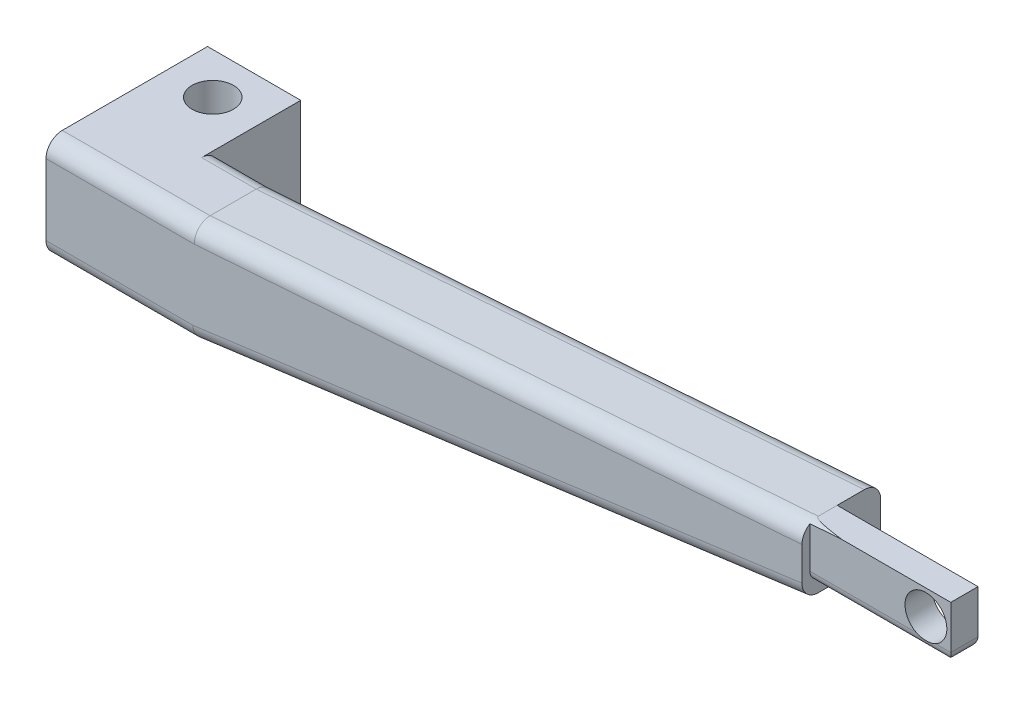
ISO-10303-21;
HEADER;
FILE_DESCRIPTION(('STEP AP214'),'2;1');
FILE_NAME('part.step','',(''),(''),'','','');
FILE_SCHEMA(('AUTOMOTIVE_DESIGN { 1 0 10303 214 1 1 1 1 }'));
ENDSEC;
DATA;
#1=APPLICATION_CONTEXT('core data for automotive mechanical design processes');
#2=APPLICATION_PROTOCOL_DEFINITION('international standard','automotive_design',2000,#1);
#3=PRODUCT_CONTEXT('',#1,'mechanical');
#4=PRODUCT('Part','Part','',(#3));
#5=PRODUCT_RELATED_PRODUCT_CATEGORY('part','',(#4));
#6=PRODUCT_DEFINITION_FORMATION('','',#4);
#7=PRODUCT_DEFINITION_CONTEXT('part definition',#1,'design');
#8=PRODUCT_DEFINITION('design','',#6,#7);
#9=PRODUCT_DEFINITION_SHAPE('','',#8);
#10=(LENGTH_UNIT() NAMED_UNIT(*) SI_UNIT(.MILLI.,.METRE.));
#11=(NAMED_UNIT(*) PLANE_ANGLE_UNIT() SI_UNIT($,.RADIAN.));
#12=(NAMED_UNIT(*) SI_UNIT($,.STERADIAN.) SOLID_ANGLE_UNIT());
#13=UNCERTAINTY_MEASURE_WITH_UNIT(LENGTH_MEASURE(1.E-05),#10,'distance_accuracy_value','');
#14=(GEOMETRIC_REPRESENTATION_CONTEXT(3) GLOBAL_UNCERTAINTY_ASSIGNED_CONTEXT((#13)) GLOBAL_UNIT_ASSIGNED_CONTEXT((#10,
#11,#12)) REPRESENTATION_CONTEXT('',''));
#15=CARTESIAN_POINT('',(0.,0.,0.));
#16=DIRECTION('',(0.,0.,1.));
#17=DIRECTION('',(1.,0.,0.));
#18=AXIS2_PLACEMENT_3D('',#15,#16,#17);
#19=CARTESIAN_POINT('',(0.,63.5,50.8));
#20=DIRECTION('',(0.,-1.,0.));
#21=DIRECTION('',(1.,0.,0.));
#22=AXIS2_PLACEMENT_3D('',#19,#20,#21);
#23=PLANE('',#22);
#24=CARTESIAN_POINT('',(-28.575,63.5,25.4));
#25=DIRECTION('',(0.,1.,0.));
#26=DIRECTION('',(-1.,0.,0.));
#27=AXIS2_PLACEMENT_3D('',#24,#25,#26);
#28=CIRCLE('',#27,12.7);
#29=CARTESIAN_POINT('',(-41.275,63.5,25.4));
#30=VERTEX_POINT('',#29);
#31=EDGE_CURVE('E389',#30,#30,#28,.T.);
#32=ORIENTED_EDGE('',*,*,#31,.F.);
#33=EDGE_LOOP('',(#32));
#34=FACE_BOUND('',#33,.T.);
#35=DIRECTION('',(0.,0.,-1.));
#36=VECTOR('',#35,1.);
#37=CARTESIAN_POINT('',(33.5017295109887,63.5,99.06));
#38=LINE('',#37,#36);
#39=CARTESIAN_POINT('',(33.5017295109887,63.5,89.06));
#40=VERTEX_POINT('',#39);
#41=CARTESIAN_POINT('',(33.5017295109887,63.5,60.8));
#42=VERTEX_POINT('',#41);
#43=EDGE_CURVE('E344',#40,#42,#38,.T.);
#44=ORIENTED_EDGE('',*,*,#43,.T.);
#45=DIRECTION('',(-1.,0.,0.));
#46=VECTOR('',#45,1.);
#47=CARTESIAN_POINT('',(0.,63.5,60.8));
#48=LINE('',#47,#46);
#49=CARTESIAN_POINT('',(0.,63.5,60.8));
#50=VERTEX_POINT('',#49);
#51=EDGE_CURVE('E446',#42,#50,#48,.T.);
#52=ORIENTED_EDGE('',*,*,#51,.T.);
#53=DIRECTION('',(0.,0.,1.));
#54=VECTOR('',#53,1.);
#55=CARTESIAN_POINT('',(0.,63.5,50.8));
#56=LINE('',#55,#54);
#57=CARTESIAN_POINT('',(0.,63.5,0.));
#58=VERTEX_POINT('',#57);
#59=EDGE_CURVE('E411',#50,#58,#56,.F.);
#60=ORIENTED_EDGE('',*,*,#59,.T.);
#61=DIRECTION('',(-1.,0.,0.));
#62=VECTOR('',#61,1.);
#63=CARTESIAN_POINT('',(0.,63.5,0.));
#64=LINE('',#63,#62);
#65=CARTESIAN_POINT('',(-57.15,63.5,0.));
#66=VERTEX_POINT('',#65);
#67=EDGE_CURVE('E403',#58,#66,#64,.T.);
#68=ORIENTED_EDGE('',*,*,#67,.T.);
#69=DIRECTION('',(0.,0.,-1.));
#70=VECTOR('',#69,1.);
#71=CARTESIAN_POINT('',(-57.15,63.5,50.8));
#72=LINE('',#71,#70);
#73=CARTESIAN_POINT('',(-57.15,63.5,89.06));
#74=VERTEX_POINT('',#73);
#75=EDGE_CURVE('E407',#74,#66,#72,.T.);
#76=ORIENTED_EDGE('',*,*,#75,.F.);
#77=DIRECTION('',(-1.,0.,0.));
#78=VECTOR('',#77,1.);
#79=CARTESIAN_POINT('',(33.5017295109887,63.5,89.06));
#80=LINE('',#79,#78);
#81=EDGE_CURVE('E443',#74,#40,#80,.F.);
#82=ORIENTED_EDGE('',*,*,#81,.T.);
#83=EDGE_LOOP('',(#44,#52,#60,#68,#76,#82));
#84=FACE_BOUND('',#83,.T.);
#85=ADVANCED_FACE('F162',(#34,#84),#23,.F.);
#86=CARTESIAN_POINT('',(-57.15,0.,50.8));
#87=DIRECTION('',(1.,0.,0.));
#88=DIRECTION('',(0.,0.,-1.));
#89=AXIS2_PLACEMENT_3D('',#86,#87,#88);
#90=PLANE('',#89);
#91=DIRECTION('',(0.,0.,-1.));
#92=VECTOR('',#91,1.);
#93=CARTESIAN_POINT('',(-57.15,0.,50.8));
#94=LINE('',#93,#92);
#95=CARTESIAN_POINT('',(-57.15,0.,89.06));
#96=VERTEX_POINT('',#95);
#97=CARTESIAN_POINT('',(-57.15,0.,0.));
#98=VERTEX_POINT('',#97);
#99=EDGE_CURVE('E404',#96,#98,#94,.T.);
#100=ORIENTED_EDGE('',*,*,#99,.F.);
#101=CARTESIAN_POINT('',(-57.15,9.99999999999999,89.06));
#102=DIRECTION('',(1.,0.,0.));
#103=DIRECTION('',(0.,0.,-1.));
#104=AXIS2_PLACEMENT_3D('',#101,#102,#103);
#105=CIRCLE('',#104,10.);
#106=CARTESIAN_POINT('',(-57.15,9.99999999999999,99.06));
#107=VERTEX_POINT('',#106);
#108=EDGE_CURVE('E513',#96,#107,#105,.F.);
#109=ORIENTED_EDGE('',*,*,#108,.T.);
#110=DIRECTION('',(0.,-1.,0.));
#111=VECTOR('',#110,1.);
#112=CARTESIAN_POINT('',(-57.15,63.5,99.06));
#113=LINE('',#112,#111);
#114=CARTESIAN_POINT('',(-57.15,53.5,99.06));
#115=VERTEX_POINT('',#114);
#116=EDGE_CURVE('E377',#115,#107,#113,.T.);
#117=ORIENTED_EDGE('',*,*,#116,.F.);
#118=CARTESIAN_POINT('',(-57.15,53.5,89.06));
#119=DIRECTION('',(1.,0.,0.));
#120=DIRECTION('',(0.,0.,-1.));
#121=AXIS2_PLACEMENT_3D('',#118,#119,#120);
#122=CIRCLE('',#121,10.);
#123=EDGE_CURVE('E510',#115,#74,#122,.F.);
#124=ORIENTED_EDGE('',*,*,#123,.T.);
#125=ORIENTED_EDGE('',*,*,#75,.T.);
#126=DIRECTION('',(0.,-1.,0.));
#127=VECTOR('',#126,1.);
#128=CARTESIAN_POINT('',(-57.15,0.,0.));
#129=LINE('',#128,#127);
#130=EDGE_CURVE('E398',#66,#98,#129,.T.);
#131=ORIENTED_EDGE('',*,*,#130,.T.);
#132=EDGE_LOOP('',(#100,#109,#117,#124,#125,#131));
#133=FACE_BOUND('',#132,.T.);
#134=ADVANCED_FACE('F605',(#133),#90,.F.);
#135=CARTESIAN_POINT('',(0.,0.,50.8));
#136=DIRECTION('',(0.,1.,0.));
#137=DIRECTION('',(-1.,0.,0.));
#138=AXIS2_PLACEMENT_3D('',#135,#136,#137);
#139=PLANE('',#138);
#140=CARTESIAN_POINT('',(-28.575,0.,25.4));
#141=DIRECTION('',(0.,1.,0.));
#142=DIRECTION('',(-1.,0.,0.));
#143=AXIS2_PLACEMENT_3D('',#140,#141,#142);
#144=CIRCLE('',#143,12.7);
#145=CARTESIAN_POINT('',(-41.275,0.,25.4));
#146=VERTEX_POINT('',#145);
#147=EDGE_CURVE('E390',#146,#146,#144,.T.);
#148=ORIENTED_EDGE('',*,*,#147,.T.);
#149=EDGE_LOOP('',(#148));
#150=FACE_BOUND('',#149,.T.);
#151=DIRECTION('',(0.,0.,1.));
#152=VECTOR('',#151,1.);
#153=CARTESIAN_POINT('',(0.,0.,50.8));
#154=LINE('',#153,#152);
#155=CARTESIAN_POINT('',(0.,0.,52.4967645251727));
#156=VERTEX_POINT('',#155);
#157=CARTESIAN_POINT('',(0.,0.,0.));
#158=VERTEX_POINT('',#157);
#159=EDGE_CURVE('E408',#156,#158,#154,.F.);
#160=ORIENTED_EDGE('',*,*,#159,.F.);
#161=CARTESIAN_POINT('',(-42.1710484774112,0.,60.8));
#162=DIRECTION('',(0.,1.,0.));
#163=DIRECTION('',(1.,0.,0.));
#164=AXIS2_PLACEMENT_3D('',#161,#162,#163);
#165=ELLIPSE('',#164,75.6727779884,10.);
#166=CARTESIAN_POINT('',(33.5017295109887,0.,60.8));
#167=VERTEX_POINT('',#166);
#168=EDGE_CURVE('E474',#156,#167,#165,.F.);
#169=ORIENTED_EDGE('',*,*,#168,.T.);
#170=DIRECTION('',(0.,0.,-1.));
#171=VECTOR('',#170,1.);
#172=CARTESIAN_POINT('',(33.5017295109887,0.,99.06));
#173=LINE('',#172,#171);
#174=CARTESIAN_POINT('',(33.5017295109887,0.,89.06));
#175=VERTEX_POINT('',#174);
#176=EDGE_CURVE('E343',#175,#167,#173,.T.);
#177=ORIENTED_EDGE('',*,*,#176,.F.);
#178=DIRECTION('',(1.,0.,0.));
#179=VECTOR('',#178,1.);
#180=CARTESIAN_POINT('',(-57.15,0.,89.06));
#181=LINE('',#180,#179);
#182=EDGE_CURVE('E471',#175,#96,#181,.F.);
#183=ORIENTED_EDGE('',*,*,#182,.T.);
#184=ORIENTED_EDGE('',*,*,#99,.T.);
#185=DIRECTION('',(1.,0.,0.));
#186=VECTOR('',#185,1.);
#187=CARTESIAN_POINT('',(0.,0.,0.));
#188=LINE('',#187,#186);
#189=EDGE_CURVE('E402',#98,#158,#188,.T.);
#190=ORIENTED_EDGE('',*,*,#189,.T.);
#191=EDGE_LOOP('',(#160,#169,#177,#183,#184,#190));
#192=FACE_BOUND('',#191,.T.);
#193=ADVANCED_FACE('F601',(#150,#192),#139,.F.);
#194=CARTESIAN_POINT('',(0.,0.,0.));
#195=DIRECTION('',(0.,0.,1.));
#196=DIRECTION('',(1.,0.,0.));
#197=AXIS2_PLACEMENT_3D('',#194,#195,#196);
#198=PLANE('',#197);
#199=DIRECTION('',(0.,1.,0.));
#200=VECTOR('',#199,1.);
#201=CARTESIAN_POINT('',(0.,0.,0.));
#202=LINE('',#201,#200);
#203=EDGE_CURVE('E394',#158,#58,#202,.T.);
#204=ORIENTED_EDGE('',*,*,#203,.F.);
#205=ORIENTED_EDGE('',*,*,#189,.F.);
#206=ORIENTED_EDGE('',*,*,#130,.F.);
#207=ORIENTED_EDGE('',*,*,#67,.F.);
#208=EDGE_LOOP('',(#204,#205,#206,#207));
#209=FACE_BOUND('',#208,.T.);
#210=ADVANCED_FACE('F597',(#209),#198,.F.);
#211=CARTESIAN_POINT('',(-28.575,0.,25.4));
#212=DIRECTION('',(0.,1.,0.));
#213=DIRECTION('',(-1.,0.,0.));
#214=AXIS2_PLACEMENT_3D('',#211,#212,#213);
#215=CYLINDRICAL_SURFACE('',#214,12.7);
#216=ORIENTED_EDGE('',*,*,#147,.F.);
#217=EDGE_LOOP('',(#216));
#218=FACE_BOUND('',#217,.T.);
#219=ORIENTED_EDGE('',*,*,#31,.T.);
#220=EDGE_LOOP('',(#219));
#221=FACE_BOUND('',#220,.T.);
#222=ADVANCED_FACE('F593',(#218,#221),#215,.F.);
#223=CARTESIAN_POINT('',(492.76,49.713718708,99.2402009409344));
#224=DIRECTION('',(-1.,0.,0.));
#225=DIRECTION('',(0.,0.,1.));
#226=AXIS2_PLACEMENT_3D('',#223,#224,#225);
#227=PLANE('',#226);
#228=DIRECTION('',(0.,-1.,0.));
#229=VECTOR('',#228,1.);
#230=CARTESIAN_POINT('',(492.76,49.713718708,94.1602009409345));
#231=LINE('',#230,#229);
#232=CARTESIAN_POINT('',(492.76,90.353718708,94.1602009409345));
#233=VERTEX_POINT('',#232);
#234=CARTESIAN_POINT('',(492.76,63.683718708,94.1602009409345));
#235=VERTEX_POINT('',#234);
#236=EDGE_CURVE('E371',#233,#235,#231,.T.);
#237=ORIENTED_EDGE('',*,*,#236,.T.);
#238=DIRECTION('',(0.,0.,-1.));
#239=VECTOR('',#238,1.);
#240=CARTESIAN_POINT('',(492.76,63.683718708,99.2402009409344));
#241=LINE('',#240,#239);
#242=CARTESIAN_POINT('',(492.76,63.683718708,77.47));
#243=VERTEX_POINT('',#242);
#244=EDGE_CURVE('E658',#235,#243,#241,.T.);
#245=ORIENTED_EDGE('',*,*,#244,.T.);
#246=DIRECTION('',(0.,1.,0.));
#247=VECTOR('',#246,1.);
#248=CARTESIAN_POINT('',(492.76,49.713718708,77.47));
#249=LINE('',#248,#247);
#250=CARTESIAN_POINT('',(492.76,90.353718708,77.47));
#251=VERTEX_POINT('',#250);
#252=EDGE_CURVE('E352',#243,#251,#249,.T.);
#253=ORIENTED_EDGE('',*,*,#252,.T.);
#254=DIRECTION('',(0.,0.,1.));
#255=VECTOR('',#254,1.);
#256=CARTESIAN_POINT('',(492.76,90.353718708,99.2402009409344));
#257=LINE('',#256,#255);
#258=EDGE_CURVE('E357',#251,#233,#257,.T.);
#259=ORIENTED_EDGE('',*,*,#258,.T.);
#260=EDGE_LOOP('',(#237,#245,#253,#259));
#261=FACE_BOUND('',#260,.T.);
#262=ADVANCED_FACE('F590',(#261),#227,.F.);
#263=CARTESIAN_POINT('',(0.,90.353718708,0.));
#264=DIRECTION('',(0.,-1.,0.));
#265=DIRECTION('',(0.,0.,-1.));
#266=AXIS2_PLACEMENT_3D('',#263,#264,#265);
#267=PLANE('',#266);
#268=DIRECTION('',(0.,0.,-1.));
#269=VECTOR('',#268,1.);
#270=CARTESIAN_POINT('',(406.4,90.353718708,99.06));
#271=LINE('',#270,#269);
#272=CARTESIAN_POINT('',(406.4,90.353718708,89.06));
#273=VERTEX_POINT('',#272);
#274=CARTESIAN_POINT('',(406.4,90.353718708,77.47));
#275=VERTEX_POINT('',#274);
#276=EDGE_CURVE('E333',#273,#275,#271,.T.);
#277=ORIENTED_EDGE('',*,*,#276,.F.);
#278=CARTESIAN_POINT('',(545.622407021187,90.353718708,89.06));
#279=DIRECTION('',(0.,-1.,0.));
#280=DIRECTION('',(1.,0.,0.));
#281=AXIS2_PLACEMENT_3D('',#278,#279,#280);
#282=ELLIPSE('',#281,139.222407021187,10.);
#283=CARTESIAN_POINT('',(425.868515185806,90.353718708,94.1602009409345));
#284=VERTEX_POINT('',#283);
#285=EDGE_CURVE('E496',#273,#284,#282,.F.);
#286=ORIENTED_EDGE('',*,*,#285,.T.);
#287=DIRECTION('',(-1.,0.,0.));
#288=VECTOR('',#287,1.);
#289=CARTESIAN_POINT('',(406.4,90.353718708,94.1602009409345));
#290=LINE('',#289,#288);
#291=EDGE_CURVE('E362',#233,#284,#290,.T.);
#292=ORIENTED_EDGE('',*,*,#291,.F.);
#293=ORIENTED_EDGE('',*,*,#258,.F.);
#294=DIRECTION('',(1.,0.,0.));
#295=VECTOR('',#294,1.);
#296=CARTESIAN_POINT('',(406.4,90.353718708,77.47));
#297=LINE('',#296,#295);
#298=EDGE_CURVE('E320',#275,#251,#297,.T.);
#299=ORIENTED_EDGE('',*,*,#298,.F.);
#300=EDGE_LOOP('',(#277,#286,#292,#293,#299));
#301=FACE_BOUND('',#300,.T.);
#302=ADVANCED_FACE('F354',(#301),#267,.F.);
#303=CARTESIAN_POINT('',(33.5017295109887,0.,99.06));
#304=DIRECTION('',(-0.132147917201255,0.991230007606393,0.));
#305=DIRECTION('',(-0.991230007606393,-0.132147917201255,0.));
#306=AXIS2_PLACEMENT_3D('',#303,#304,#305);
#307=PLANE('',#306);
#308=ORIENTED_EDGE('',*,*,#176,.T.);
#309=DIRECTION('',(0.991230007606393,0.132147917201255,0.));
#310=VECTOR('',#309,1.);
#311=CARTESIAN_POINT('',(33.5017295109887,0.,60.8));
#312=LINE('',#311,#310);
#313=CARTESIAN_POINT('',(406.4,49.713718708,60.8));
#314=VERTEX_POINT('',#313);
#315=EDGE_CURVE('E462',#167,#314,#312,.T.);
#316=ORIENTED_EDGE('',*,*,#315,.T.);
#317=DIRECTION('',(0.,0.,1.));
#318=VECTOR('',#317,1.);
#319=CARTESIAN_POINT('',(406.4,49.713718708,99.06));
#320=LINE('',#319,#318);
#321=CARTESIAN_POINT('',(406.4,49.713718708,89.06));
#322=VERTEX_POINT('',#321);
#323=EDGE_CURVE('E351',#314,#322,#320,.T.);
#324=ORIENTED_EDGE('',*,*,#323,.T.);
#325=DIRECTION('',(0.991230007606393,0.132147917201255,0.));
#326=VECTOR('',#325,1.);
#327=CARTESIAN_POINT('',(33.5017295109887,0.,89.06));
#328=LINE('',#327,#326);
#329=EDGE_CURVE('E459',#322,#175,#328,.F.);
#330=ORIENTED_EDGE('',*,*,#329,.T.);
#331=EDGE_LOOP('',(#308,#316,#324,#330));
#332=FACE_BOUND('',#331,.T.);
#333=ADVANCED_FACE('F584',(#332),#307,.F.);
#334=CARTESIAN_POINT('',(33.5017295109887,63.5,99.06));
#335=DIRECTION('',(0.0718275183855872,-0.99741706803251,0.));
#336=DIRECTION('',(0.99741706803251,0.0718275183855872,0.));
#337=AXIS2_PLACEMENT_3D('',#334,#335,#336);
#338=PLANE('',#337);
#339=DIRECTION('',(0.,0.,1.));
#340=VECTOR('',#339,1.);
#341=CARTESIAN_POINT('',(406.4,90.353718708,50.8));
#342=LINE('',#341,#340);
#343=CARTESIAN_POINT('',(406.4,90.353718708,60.8));
#344=VERTEX_POINT('',#343);
#345=EDGE_CURVE('E335',#344,#275,#342,.T.);
#346=ORIENTED_EDGE('',*,*,#345,.F.);
#347=DIRECTION('',(-0.99741706803251,-0.0718275183855872,0.));
#348=VECTOR('',#347,1.);
#349=CARTESIAN_POINT('',(33.5017295109887,63.5,60.8));
#350=LINE('',#349,#348);
#351=EDGE_CURVE('E479',#344,#42,#350,.T.);
#352=ORIENTED_EDGE('',*,*,#351,.T.);
#353=ORIENTED_EDGE('',*,*,#43,.F.);
#354=DIRECTION('',(-0.99741706803251,-0.0718275183855872,0.));
#355=VECTOR('',#354,1.);
#356=CARTESIAN_POINT('',(406.4,90.353718708,89.06));
#357=LINE('',#356,#355);
#358=EDGE_CURVE('E339',#40,#273,#357,.F.);
#359=ORIENTED_EDGE('',*,*,#358,.T.);
#360=ORIENTED_EDGE('',*,*,#276,.T.);
#361=EDGE_LOOP('',(#346,#352,#353,#359,#360));
#362=FACE_BOUND('',#361,.T.);
#363=ADVANCED_FACE('F334',(#362),#338,.F.);
#364=CARTESIAN_POINT('',(0.,0.,99.06));
#365=DIRECTION('',(0.,0.,1.));
#366=DIRECTION('',(1.,0.,0.));
#367=AXIS2_PLACEMENT_3D('',#364,#365,#366);
#368=PLANE('',#367);
#369=DIRECTION('',(1.,0.,0.));
#370=VECTOR('',#369,1.);
#371=CARTESIAN_POINT('',(33.5017295109887,10.,99.06));
#372=LINE('',#371,#370);
#373=CARTESIAN_POINT('',(32.8380798236274,10.,99.06));
#374=VERTEX_POINT('',#373);
#375=EDGE_CURVE('E489',#107,#374,#372,.T.);
#376=ORIENTED_EDGE('',*,*,#375,.T.);
#377=DIRECTION('',(0.991230007606393,0.132147917201255,0.));
#378=VECTOR('',#377,1.);
#379=CARTESIAN_POINT('',(405.078520827988,59.626018784064,99.06));
#380=LINE('',#379,#378);
#381=CARTESIAN_POINT('',(406.4,59.8021945645248,99.06));
#382=VERTEX_POINT('',#381);
#383=EDGE_CURVE('E492',#374,#382,#380,.T.);
#384=ORIENTED_EDGE('',*,*,#383,.T.);
#385=DIRECTION('',(0.,-1.,0.));
#386=VECTOR('',#385,1.);
#387=CARTESIAN_POINT('',(406.4,0.,99.06));
#388=LINE('',#387,#386);
#389=CARTESIAN_POINT('',(406.4,80.3278225001821,99.06));
#390=VERTEX_POINT('',#389);
#391=EDGE_CURVE('E433',#390,#382,#388,.T.);
#392=ORIENTED_EDGE('',*,*,#391,.F.);
#393=DIRECTION('',(-0.99741706803251,-0.0718275183855872,0.));
#394=VECTOR('',#393,1.);
#395=CARTESIAN_POINT('',(34.2200046948446,53.5258293196749,99.06));
#396=LINE('',#395,#394);
#397=CARTESIAN_POINT('',(33.8613315166746,53.5,99.06));
#398=VERTEX_POINT('',#397);
#399=EDGE_CURVE('E485',#390,#398,#396,.T.);
#400=ORIENTED_EDGE('',*,*,#399,.T.);
#401=DIRECTION('',(-1.,0.,0.));
#402=VECTOR('',#401,1.);
#403=CARTESIAN_POINT('',(-57.15,53.5,99.06));
#404=LINE('',#403,#402);
#405=EDGE_CURVE('E482',#398,#115,#404,.T.);
#406=ORIENTED_EDGE('',*,*,#405,.T.);
#407=ORIENTED_EDGE('',*,*,#116,.T.);
#408=EDGE_LOOP('',(#376,#384,#392,#400,#406,#407));
#409=FACE_BOUND('',#408,.T.);
#410=ADVANCED_FACE('F575',(#409),#368,.T.);
#411=CARTESIAN_POINT('',(0.,0.,50.8));
#412=DIRECTION('',(0.,0.,1.));
#413=DIRECTION('',(1.,0.,0.));
#414=AXIS2_PLACEMENT_3D('',#411,#412,#413);
#415=PLANE('',#414);
#416=DIRECTION('',(0.,-1.,0.));
#417=VECTOR('',#416,1.);
#418=CARTESIAN_POINT('',(406.4,0.,50.8));
#419=LINE('',#418,#417);
#420=CARTESIAN_POINT('',(406.4,80.3278225001821,50.8));
#421=VERTEX_POINT('',#420);
#422=CARTESIAN_POINT('',(406.4,59.8021945645248,50.8));
#423=VERTEX_POINT('',#422);
#424=EDGE_CURVE('E429',#421,#423,#419,.T.);
#425=ORIENTED_EDGE('',*,*,#424,.T.);
#426=DIRECTION('',(0.991230007606393,0.132147917201255,0.));
#427=VECTOR('',#426,1.);
#428=CARTESIAN_POINT('',(-0.736436056746496,5.52394266660088,50.8));
#429=LINE('',#428,#427);
#430=CARTESIAN_POINT('',(0.,5.62212219133698,50.8));
#431=VERTEX_POINT('',#430);
#432=EDGE_CURVE('E456',#423,#431,#429,.F.);
#433=ORIENTED_EDGE('',*,*,#432,.T.);
#434=DIRECTION('',(0.,1.,0.));
#435=VECTOR('',#434,1.);
#436=CARTESIAN_POINT('',(0.,0.,50.8));
#437=LINE('',#436,#435);
#438=CARTESIAN_POINT('',(0.,53.5,50.8));
#439=VERTEX_POINT('',#438);
#440=EDGE_CURVE('E415',#431,#439,#437,.T.);
#441=ORIENTED_EDGE('',*,*,#440,.T.);
#442=DIRECTION('',(-1.,0.,0.));
#443=VECTOR('',#442,1.);
#444=CARTESIAN_POINT('',(0.,53.5,50.8));
#445=LINE('',#444,#443);
#446=CARTESIAN_POINT('',(33.8613315166747,53.5,50.8));
#447=VERTEX_POINT('',#446);
#448=EDGE_CURVE('E453',#439,#447,#445,.F.);
#449=ORIENTED_EDGE('',*,*,#448,.T.);
#450=DIRECTION('',(-0.99741706803251,-0.0718275183855872,0.));
#451=VECTOR('',#450,1.);
#452=CARTESIAN_POINT('',(-3.65814949025514,50.7980899382854,50.8));
#453=LINE('',#452,#451);
#454=EDGE_CURVE('E450',#447,#421,#453,.F.);
#455=ORIENTED_EDGE('',*,*,#454,.T.);
#456=EDGE_LOOP('',(#425,#433,#441,#449,#455));
#457=FACE_BOUND('',#456,.T.);
#458=ADVANCED_FACE('F573',(#457),#415,.F.);
#459=CARTESIAN_POINT('',(0.,111.76,50.8));
#460=DIRECTION('',(1.,0.,0.));
#461=DIRECTION('',(0.,1.,0.));
#462=AXIS2_PLACEMENT_3D('',#459,#460,#461);
#463=PLANE('',#462);
#464=ORIENTED_EDGE('',*,*,#59,.F.);
#465=CARTESIAN_POINT('',(0.,53.5,60.8));
#466=DIRECTION('',(1.,0.,0.));
#467=DIRECTION('',(0.,1.,0.));
#468=AXIS2_PLACEMENT_3D('',#465,#466,#467);
#469=CIRCLE('',#468,10.);
#470=EDGE_CURVE('E516',#50,#439,#469,.F.);
#471=ORIENTED_EDGE('',*,*,#470,.T.);
#472=ORIENTED_EDGE('',*,*,#440,.F.);
#473=CARTESIAN_POINT('',(0.,5.62212219133698,60.8));
#474=DIRECTION('',(1.,0.,0.));
#475=DIRECTION('',(0.,1.,0.));
#476=AXIS2_PLACEMENT_3D('',#473,#474,#475);
#477=ELLIPSE('',#476,10.0884758565248,10.);
#478=EDGE_CURVE('E519',#431,#156,#477,.F.);
#479=ORIENTED_EDGE('',*,*,#478,.T.);
#480=ORIENTED_EDGE('',*,*,#159,.T.);
#481=ORIENTED_EDGE('',*,*,#203,.T.);
#482=EDGE_LOOP('',(#464,#471,#472,#479,#480,#481));
#483=FACE_BOUND('',#482,.T.);
#484=ADVANCED_FACE('F570',(#483),#463,.T.);
#485=CARTESIAN_POINT('',(406.4,-11.246281292,50.8));
#486=DIRECTION('',(-1.,0.,0.));
#487=DIRECTION('',(0.,0.,1.));
#488=AXIS2_PLACEMENT_3D('',#485,#486,#487);
#489=PLANE('',#488);
#490=DIRECTION('',(0.,1.,0.));
#491=VECTOR('',#490,1.);
#492=CARTESIAN_POINT('',(406.4,-11.246281292,77.47));
#493=LINE('',#492,#491);
#494=CARTESIAN_POINT('',(406.4,63.683718708,77.47));
#495=VERTEX_POINT('',#494);
#496=EDGE_CURVE('E315',#495,#275,#493,.T.);
#497=ORIENTED_EDGE('',*,*,#496,.F.);
#498=CARTESIAN_POINT('',(406.4,63.683718708,83.82));
#499=DIRECTION('',(-1.,0.,0.));
#500=DIRECTION('',(0.,0.,1.));
#501=AXIS2_PLACEMENT_3D('',#498,#499,#500);
#502=CIRCLE('',#501,6.35);
#503=CARTESIAN_POINT('',(406.4,57.333718708,83.82));
#504=VERTEX_POINT('',#503);
#505=EDGE_CURVE('E173',#495,#504,#502,.T.);
#506=ORIENTED_EDGE('',*,*,#505,.T.);
#507=DIRECTION('',(0.,0.,1.));
#508=VECTOR('',#507,1.);
#509=CARTESIAN_POINT('',(406.4,57.333718708,68.7602009409345));
#510=LINE('',#509,#508);
#511=CARTESIAN_POINT('',(406.4,57.333718708,87.8102009409345));
#512=VERTEX_POINT('',#511);
#513=EDGE_CURVE('E365',#504,#512,#510,.T.);
#514=ORIENTED_EDGE('',*,*,#513,.T.);
#515=CARTESIAN_POINT('',(406.4,63.683718708,87.8102009409345));
#516=DIRECTION('',(-1.,0.,0.));
#517=DIRECTION('',(0.,0.,1.));
#518=AXIS2_PLACEMENT_3D('',#515,#516,#517);
#519=CIRCLE('',#518,6.35);
#520=CARTESIAN_POINT('',(406.4,63.683718708,94.1602009409345));
#521=VERTEX_POINT('',#520);
#522=EDGE_CURVE('E12',#512,#521,#519,.T.);
#523=ORIENTED_EDGE('',*,*,#522,.T.);
#524=DIRECTION('',(0.,1.,0.));
#525=VECTOR('',#524,1.);
#526=CARTESIAN_POINT('',(406.4,-11.246281292,94.1602009409345));
#527=LINE('',#526,#525);
#528=CARTESIAN_POINT('',(406.4,88.9517223142484,94.1602009409345));
#529=VERTEX_POINT('',#528);
#530=EDGE_CURVE('E359',#521,#529,#527,.T.);
#531=ORIENTED_EDGE('',*,*,#530,.T.);
#532=CARTESIAN_POINT('',(406.4,80.3278225001821,89.06));
#533=DIRECTION('',(-1.,0.,0.));
#534=DIRECTION('',(0.,1.,0.));
#535=AXIS2_PLACEMENT_3D('',#532,#533,#534);
#536=ELLIPSE('',#535,10.0258962078179,10.);
#537=EDGE_CURVE('E507',#529,#390,#536,.F.);
#538=ORIENTED_EDGE('',*,*,#537,.T.);
#539=ORIENTED_EDGE('',*,*,#391,.T.);
#540=CARTESIAN_POINT('',(406.4,59.8021945645248,89.06));
#541=DIRECTION('',(-1.,0.,0.));
#542=DIRECTION('',(0.,-1.,0.));
#543=AXIS2_PLACEMENT_3D('',#540,#541,#542);
#544=ELLIPSE('',#543,10.0884758565248,10.);
#545=EDGE_CURVE('E503',#382,#322,#544,.F.);
#546=ORIENTED_EDGE('',*,*,#545,.T.);
#547=ORIENTED_EDGE('',*,*,#323,.F.);
#548=CARTESIAN_POINT('',(406.4,59.8021945645248,60.8));
#549=DIRECTION('',(-1.,0.,0.));
#550=DIRECTION('',(0.,1.,0.));
#551=AXIS2_PLACEMENT_3D('',#548,#549,#550);
#552=ELLIPSE('',#551,10.0884758565248,10.);
#553=EDGE_CURVE('E468',#314,#423,#552,.F.);
#554=ORIENTED_EDGE('',*,*,#553,.T.);
#555=ORIENTED_EDGE('',*,*,#424,.F.);
#556=CARTESIAN_POINT('',(406.4,80.3278225001821,60.8));
#557=DIRECTION('',(-1.,0.,0.));
#558=DIRECTION('',(0.,-1.,0.));
#559=AXIS2_PLACEMENT_3D('',#556,#557,#558);
#560=ELLIPSE('',#559,10.0258962078179,10.);
#561=EDGE_CURVE('E349',#421,#344,#560,.F.);
#562=ORIENTED_EDGE('',*,*,#561,.T.);
#563=ORIENTED_EDGE('',*,*,#345,.T.);
#564=EDGE_LOOP('',(#497,#506,#514,#523,#531,#538,#539,#546,#547,#554,#555,#562,#563));
#565=FACE_BOUND('',#564,.T.);
#566=ADVANCED_FACE('F346',(#565),#489,.F.);
#567=CARTESIAN_POINT('',(406.4,-11.246281292,94.1602009409345));
#568=DIRECTION('',(0.,0.,-1.));
#569=DIRECTION('',(-1.,0.,0.));
#570=AXIS2_PLACEMENT_3D('',#567,#568,#569);
#571=PLANE('',#570);
#572=ORIENTED_EDGE('',*,*,#530,.F.);
#573=DIRECTION('',(1.,0.,0.));
#574=VECTOR('',#573,1.);
#575=CARTESIAN_POINT('',(406.4,63.683718708,94.1602009409345));
#576=LINE('',#575,#574);
#577=CARTESIAN_POINT('',(471.688085856586,63.683718708,94.1602009409345));
#578=VERTEX_POINT('',#577);
#579=EDGE_CURVE('E669',#521,#578,#576,.T.);
#580=ORIENTED_EDGE('',*,*,#579,.T.);
#581=CARTESIAN_POINT('',(477.52,75.113718708,94.1602009409345));
#582=DIRECTION('',(0.,0.,-1.));
#583=DIRECTION('',(-1.,0.,0.));
#584=AXIS2_PLACEMENT_3D('',#581,#582,#583);
#585=CIRCLE('',#584,12.8318401866664);
#586=CARTESIAN_POINT('',(483.351914143414,63.683718708,94.1602009409345));
#587=VERTEX_POINT('',#586);
#588=EDGE_CURVE('E328',#587,#578,#585,.F.);
#589=ORIENTED_EDGE('',*,*,#588,.F.);
#590=DIRECTION('',(1.,0.,0.));
#591=VECTOR('',#590,1.);
#592=CARTESIAN_POINT('',(406.4,63.683718708,94.1602009409345));
#593=LINE('',#592,#591);
#594=EDGE_CURVE('E187',#587,#235,#593,.T.);
#595=ORIENTED_EDGE('',*,*,#594,.T.);
#596=ORIENTED_EDGE('',*,*,#236,.F.);
#597=ORIENTED_EDGE('',*,*,#291,.T.);
#598=DIRECTION('',(0.99741706803251,0.0718275183855872,0.));
#599=VECTOR('',#598,1.);
#600=CARTESIAN_POINT('',(425.868515185806,90.353718708,94.1602009409345));
#601=LINE('',#600,#599);
#602=EDGE_CURVE('E499',#284,#529,#601,.F.);
#603=ORIENTED_EDGE('',*,*,#602,.T.);
#604=EDGE_LOOP('',(#572,#580,#589,#595,#596,#597,#603));
#605=FACE_BOUND('',#604,.T.);
#606=ADVANCED_FACE('F565',(#605),#571,.F.);
#607=CARTESIAN_POINT('',(406.4,-11.246281292,77.47));
#608=DIRECTION('',(0.,0.,1.));
#609=DIRECTION('',(1.,0.,0.));
#610=AXIS2_PLACEMENT_3D('',#607,#608,#609);
#611=PLANE('',#610);
#612=ORIENTED_EDGE('',*,*,#252,.F.);
#613=DIRECTION('',(-1.,0.,0.));
#614=VECTOR('',#613,1.);
#615=CARTESIAN_POINT('',(406.4,63.683718708,77.47));
#616=LINE('',#615,#614);
#617=CARTESIAN_POINT('',(483.351914143414,63.683718708,77.47));
#618=VERTEX_POINT('',#617);
#619=EDGE_CURVE('E539',#243,#618,#616,.T.);
#620=ORIENTED_EDGE('',*,*,#619,.T.);
#621=CARTESIAN_POINT('',(477.52,75.113718708,77.47));
#622=DIRECTION('',(0.,0.,1.));
#623=DIRECTION('',(1.,0.,0.));
#624=AXIS2_PLACEMENT_3D('',#621,#622,#623);
#625=CIRCLE('',#624,12.8318401866664);
#626=CARTESIAN_POINT('',(471.688085856586,63.683718708,77.47));
#627=VERTEX_POINT('',#626);
#628=EDGE_CURVE('E374',#627,#618,#625,.F.);
#629=ORIENTED_EDGE('',*,*,#628,.F.);
#630=DIRECTION('',(-1.,0.,0.));
#631=VECTOR('',#630,1.);
#632=CARTESIAN_POINT('',(406.4,63.683718708,77.47));
#633=LINE('',#632,#631);
#634=EDGE_CURVE('E324',#627,#495,#633,.T.);
#635=ORIENTED_EDGE('',*,*,#634,.T.);
#636=ORIENTED_EDGE('',*,*,#496,.T.);
#637=ORIENTED_EDGE('',*,*,#298,.T.);
#638=EDGE_LOOP('',(#612,#620,#629,#635,#636,#637));
#639=FACE_BOUND('',#638,.T.);
#640=ADVANCED_FACE('F318',(#639),#611,.F.);
#641=CARTESIAN_POINT('',(477.52,75.113718708,-2.54));
#642=DIRECTION('',(0.,0.,1.));
#643=DIRECTION('',(1.,0.,0.));
#644=AXIS2_PLACEMENT_3D('',#641,#642,#643);
#645=CYLINDRICAL_SURFACE('',#644,12.8318401866664);
#646=ORIENTED_EDGE('',*,*,#628,.T.);
#647=CARTESIAN_POINT('',(483.351914143414,63.683718708,77.47));
#648=CARTESIAN_POINT('',(483.193342244024,63.6028079642002,77.4700090047565));
#649=CARTESIAN_POINT('',(483.033095443702,63.5252072052714,77.4715465076093));
#650=CARTESIAN_POINT('',(482.709560499841,63.3767581670114,77.4769864467039));
#651=CARTESIAN_POINT('',(482.546272651222,63.3059092369282,77.4808886547643));
#652=CARTESIAN_POINT('',(482.216961216663,63.1710921103342,77.4903654085028));
#653=CARTESIAN_POINT('',(482.050938098217,63.1071227517992,77.4959396711506));
#654=CARTESIAN_POINT('',(481.716418596053,62.9861534930297,77.508138783121));
#655=CARTESIAN_POINT('',(481.547922151422,62.9291537647677,77.5147636583579));
#656=CARTESIAN_POINT('',(481.039612760625,62.7689016866393,77.5353150735883));
#657=CARTESIAN_POINT('',(480.696441146906,62.6761760732037,77.5499377340868));
#658=CARTESIAN_POINT('',(480.003552947338,62.519502372286,77.5771304362416));
#659=CARTESIAN_POINT('',(479.653836359782,62.4555542923104,77.5897004773625));
#660=CARTESIAN_POINT('',(478.947411120674,62.3564938129484,77.610042857806));
#661=CARTESIAN_POINT('',(478.590669281723,62.3216088022604,77.6177772480183));
#662=CARTESIAN_POINT('',(477.875427101191,62.2818020095679,77.6266526989305));
#663=CARTESIAN_POINT('',(477.516926731667,62.2768807052363,77.6277936545197));
#664=CARTESIAN_POINT('',(476.800943218783,62.2970380728363,77.6232494231421));
#665=CARTESIAN_POINT('',(476.443459769099,62.322106471229,77.6175665737961));
#666=CARTESIAN_POINT('',(475.731995515288,62.4020199072028,77.6005613136606));
#667=CARTESIAN_POINT('',(475.378014439274,62.4568626146674,77.5892393441905));
#668=CARTESIAN_POINT('',(474.737260559762,62.5837636581263,77.5657247492415));
#669=CARTESIAN_POINT('',(474.449533244127,62.6511514317344,77.5540283406894));
#670=CARTESIAN_POINT('',(473.87946493076,62.8055987751465,77.5305236628068));
#671=CARTESIAN_POINT('',(473.597122957209,62.8926547436549,77.5187154143334));
#672=CARTESIAN_POINT('',(473.038983513457,63.086090669491,77.4974367364271));
#673=CARTESIAN_POINT('',(472.76318664749,63.1924724031537,77.4879665220843));
#674=CARTESIAN_POINT('',(472.355404048346,63.3661689686502,77.4776803280429));
#675=CARTESIAN_POINT('',(472.220430580317,63.4264378267477,77.4749045910152));
#676=CARTESIAN_POINT('',(471.95261787843,63.5516156295724,77.4710660986731));
#677=CARTESIAN_POINT('',(471.81977878772,63.6165248839428,77.4700034577814));
#678=CARTESIAN_POINT('',(471.688085856586,63.683718708,77.47));
#679=B_SPLINE_CURVE_WITH_KNOTS('',3,(#647,#648,#649,#650,#651,#652,#653,#654,#655,#656,#657,
#658,#659,#660,#661,#662,#663,#664,#665,#666,#667,#668,#669,#670,#671,#672,#673,#674,#675,#676,
#677,#678),.UNSPECIFIED.,.F.,.F.,(4,2,2,2,2,2,2,2,2,2,2,2,2,2,2,4),(0.,0.534000464389236,
1.06794940880097,1.60180802209125,2.1356798054417,3.20168198884114,4.2676844503056,
5.34195097879818,6.4162346328987,7.49015037621095,8.56398208774361,9.45053471004969,
10.3369251337288,11.2233970715743,11.6668439399093,12.1103204261255),.UNSPECIFIED.);
#680=EDGE_CURVE('E551',#618,#627,#679,.T.);
#681=ORIENTED_EDGE('',*,*,#680,.T.);
#682=EDGE_LOOP('',(#646,#681));
#683=FACE_BOUND('',#682,.T.);
#684=ORIENTED_EDGE('',*,*,#588,.T.);
#685=CARTESIAN_POINT('',(471.688085856586,63.683718708,94.1602009409345));
#686=CARTESIAN_POINT('',(471.846657755976,63.6028079642002,94.160191936178));
#687=CARTESIAN_POINT('',(472.006904556298,63.5252072052714,94.1586544333252));
#688=CARTESIAN_POINT('',(472.330439500158,63.3767581670114,94.1532144942305));
#689=CARTESIAN_POINT('',(472.493727348778,63.3059092369282,94.1493122861701));
#690=CARTESIAN_POINT('',(472.823038783337,63.1710921103342,94.1398355324316));
#691=CARTESIAN_POINT('',(472.989061901783,63.1071227517992,94.1342612697839));
#692=CARTESIAN_POINT('',(473.323581403947,62.9861534930297,94.1220621578134));
#693=CARTESIAN_POINT('',(473.492077848578,62.9291537647677,94.1154372825765));
#694=CARTESIAN_POINT('',(474.000387239375,62.7689016866393,94.0948858673461));
#695=CARTESIAN_POINT('',(474.343558853094,62.6761760732037,94.0802632068476));
#696=CARTESIAN_POINT('',(475.036447052662,62.519502372286,94.0530705046928));
#697=CARTESIAN_POINT('',(475.386163640218,62.4555542923104,94.0405004635719));
#698=CARTESIAN_POINT('',(476.092588879326,62.3564938129484,94.0201580831285));
#699=CARTESIAN_POINT('',(476.449330718277,62.3216088022604,94.0124236929162));
#700=CARTESIAN_POINT('',(477.164572898809,62.2818020095679,94.003548242004));
#701=CARTESIAN_POINT('',(477.523073268333,62.2768807052363,94.0024072864148));
#702=CARTESIAN_POINT('',(478.239056781217,62.2970380728363,94.0069515177923));
#703=CARTESIAN_POINT('',(478.596540230901,62.322106471229,94.0126343671384));
#704=CARTESIAN_POINT('',(479.308004484712,62.4020199072028,94.0296396272738));
#705=CARTESIAN_POINT('',(479.661985560726,62.4568626146674,94.040961596744));
#706=CARTESIAN_POINT('',(480.302739440238,62.5837636581263,94.0644761916929));
#707=CARTESIAN_POINT('',(480.590466755873,62.6511514317344,94.0761726002451));
#708=CARTESIAN_POINT('',(481.16053506924,62.8055987751465,94.0996772781276));
#709=CARTESIAN_POINT('',(481.442877042791,62.8926547436549,94.111485526601));
#710=CARTESIAN_POINT('',(482.001016486543,63.086090669491,94.1327642045074));
#711=CARTESIAN_POINT('',(482.27681335251,63.1924724031537,94.1422344188501));
#712=CARTESIAN_POINT('',(482.684595951654,63.3661689686502,94.1525206128915));
#713=CARTESIAN_POINT('',(482.819569419683,63.4264378267477,94.1552963499192));
#714=CARTESIAN_POINT('',(483.08738212157,63.5516156295724,94.1591348422614));
#715=CARTESIAN_POINT('',(483.22022121228,63.6165248839428,94.1601974831531));
#716=CARTESIAN_POINT('',(483.351914143414,63.683718708,94.1602009409345));
#717=B_SPLINE_CURVE_WITH_KNOTS('',3,(#685,#686,#687,#688,#689,#690,#691,#692,#693,#694,#695,
#696,#697,#698,#699,#700,#701,#702,#703,#704,#705,#706,#707,#708,#709,#710,#711,#712,#713,#714,
#715,#716),.UNSPECIFIED.,.F.,.F.,(4,2,2,2,2,2,2,2,2,2,2,2,2,2,2,4),(0.,0.534000464389236,
1.06794940880097,1.60180802209125,2.1356798054417,3.20168198884114,4.2676844503056,
5.34195097879818,6.4162346328987,7.490150376211,8.56398208774361,9.45053471004969,
10.3369251337288,11.2233970715742,11.6668439399092,12.1103204261255),.UNSPECIFIED.);
#718=EDGE_CURVE('E543',#578,#587,#717,.T.);
#719=ORIENTED_EDGE('',*,*,#718,.T.);
#720=EDGE_LOOP('',(#684,#719));
#721=FACE_BOUND('',#720,.T.);
#722=ADVANCED_FACE('F558',(#683,#721),#645,.F.);
#723=CARTESIAN_POINT('',(34.2200046948446,53.5258293196749,60.8));
#724=DIRECTION('',(-0.99741706803251,-0.0718275183855872,0.));
#725=DIRECTION('',(0.0718275183855872,-0.99741706803251,0.));
#726=AXIS2_PLACEMENT_3D('',#723,#724,#725);
#727=CYLINDRICAL_SURFACE('',#726,10.);
#728=ORIENTED_EDGE('',*,*,#561,.F.);
#729=ORIENTED_EDGE('',*,*,#454,.F.);
#730=CARTESIAN_POINT('',(33.8613315166738,53.5,60.8));
#731=DIRECTION('',(-0.999354058387844,-0.0359369723786677,0.));
#732=DIRECTION('',(-0.0359369723786676,0.999354058387844,0.));
#733=AXIS2_PLACEMENT_3D('',#730,#731,#732);
#734=ELLIPSE('',#733,10.0064635912241,10.);
#735=EDGE_CURVE('E369',#42,#447,#734,.T.);
#736=ORIENTED_EDGE('',*,*,#735,.F.);
#737=ORIENTED_EDGE('',*,*,#351,.F.);
#738=EDGE_LOOP('',(#728,#729,#736,#737));
#739=FACE_BOUND('',#738,.T.);
#740=ADVANCED_FACE('F563',(#739),#727,.T.);
#741=CARTESIAN_POINT('',(0.,53.5,60.8));
#742=DIRECTION('',(-1.,0.,0.));
#743=DIRECTION('',(0.,-1.,0.));
#744=AXIS2_PLACEMENT_3D('',#741,#742,#743);
#745=CYLINDRICAL_SURFACE('',#744,10.);
#746=ORIENTED_EDGE('',*,*,#735,.T.);
#747=ORIENTED_EDGE('',*,*,#448,.F.);
#748=ORIENTED_EDGE('',*,*,#470,.F.);
#749=ORIENTED_EDGE('',*,*,#51,.F.);
#750=EDGE_LOOP('',(#746,#747,#748,#749));
#751=FACE_BOUND('',#750,.T.);
#752=ADVANCED_FACE('F613',(#751),#745,.T.);
#753=CARTESIAN_POINT('',(32.1802503389762,9.91230007606393,60.8));
#754=DIRECTION('',(0.991230007606393,0.132147917201255,0.));
#755=DIRECTION('',(-0.132147917201255,0.991230007606393,0.));
#756=AXIS2_PLACEMENT_3D('',#753,#754,#755);
#757=CYLINDRICAL_SURFACE('',#756,10.);
#758=ORIENTED_EDGE('',*,*,#478,.F.);
#759=ORIENTED_EDGE('',*,*,#432,.F.);
#760=ORIENTED_EDGE('',*,*,#553,.F.);
#761=ORIENTED_EDGE('',*,*,#315,.F.);
#762=ORIENTED_EDGE('',*,*,#168,.F.);
#763=EDGE_LOOP('',(#758,#759,#760,#761,#762));
#764=FACE_BOUND('',#763,.T.);
#765=ADVANCED_FACE('F616',(#764),#757,.T.);
#766=CARTESIAN_POINT('',(0.,53.5,89.06));
#767=DIRECTION('',(1.,0.,0.));
#768=DIRECTION('',(0.,1.,0.));
#769=AXIS2_PLACEMENT_3D('',#766,#767,#768);
#770=CYLINDRICAL_SURFACE('',#769,10.);
#771=ORIENTED_EDGE('',*,*,#123,.F.);
#772=ORIENTED_EDGE('',*,*,#405,.F.);
#773=CARTESIAN_POINT('',(33.8613315166747,53.5,89.06));
#774=DIRECTION('',(0.999354058387844,0.0359369723786677,0.));
#775=DIRECTION('',(-0.0359369723786676,0.999354058387844,0.));
#776=AXIS2_PLACEMENT_3D('',#773,#774,#775);
#777=ELLIPSE('',#776,10.0064635912241,10.);
#778=EDGE_CURVE('E526',#40,#398,#777,.T.);
#779=ORIENTED_EDGE('',*,*,#778,.F.);
#780=ORIENTED_EDGE('',*,*,#81,.F.);
#781=EDGE_LOOP('',(#771,#772,#779,#780));
#782=FACE_BOUND('',#781,.T.);
#783=ADVANCED_FACE('F623',(#782),#770,.T.);
#784=CARTESIAN_POINT('',(-3.65814949025514,50.7980899382854,89.06));
#785=DIRECTION('',(0.99741706803251,0.0718275183855872,0.));
#786=DIRECTION('',(-0.0718275183855872,0.99741706803251,0.));
#787=AXIS2_PLACEMENT_3D('',#784,#785,#786);
#788=CYLINDRICAL_SURFACE('',#787,10.);
#789=ORIENTED_EDGE('',*,*,#285,.F.);
#790=ORIENTED_EDGE('',*,*,#358,.F.);
#791=ORIENTED_EDGE('',*,*,#778,.T.);
#792=ORIENTED_EDGE('',*,*,#399,.F.);
#793=ORIENTED_EDGE('',*,*,#537,.F.);
#794=ORIENTED_EDGE('',*,*,#602,.F.);
#795=EDGE_LOOP('',(#789,#790,#791,#792,#793,#794));
#796=FACE_BOUND('',#795,.T.);
#797=ADVANCED_FACE('F625',(#796),#788,.T.);
#798=CARTESIAN_POINT('',(0.,10.,89.06));
#799=DIRECTION('',(-1.,0.,0.));
#800=DIRECTION('',(0.,-1.,0.));
#801=AXIS2_PLACEMENT_3D('',#798,#799,#800);
#802=CYLINDRICAL_SURFACE('',#801,10.);
#803=ORIENTED_EDGE('',*,*,#108,.F.);
#804=ORIENTED_EDGE('',*,*,#182,.F.);
#805=CARTESIAN_POINT('',(32.8380798236274,10.,89.06));
#806=DIRECTION('',(-0.997805093093434,-0.0662193038079034,0.));
#807=DIRECTION('',(-0.0662193038079032,0.997805093093434,0.));
#808=AXIS2_PLACEMENT_3D('',#805,#806,#807);
#809=ELLIPSE('',#808,10.0219973512037,10.);
#810=EDGE_CURVE('E529',#374,#175,#809,.F.);
#811=ORIENTED_EDGE('',*,*,#810,.F.);
#812=ORIENTED_EDGE('',*,*,#375,.F.);
#813=EDGE_LOOP('',(#803,#804,#811,#812));
#814=FACE_BOUND('',#813,.T.);
#815=ADVANCED_FACE('F628',(#814),#802,.T.);
#816=CARTESIAN_POINT('',(-0.736436056746496,5.52394266660088,89.06));
#817=DIRECTION('',(-0.991230007606393,-0.132147917201255,0.));
#818=DIRECTION('',(0.132147917201255,-0.991230007606393,0.));
#819=AXIS2_PLACEMENT_3D('',#816,#817,#818);
#820=CYLINDRICAL_SURFACE('',#819,10.);
#821=ORIENTED_EDGE('',*,*,#810,.T.);
#822=ORIENTED_EDGE('',*,*,#329,.F.);
#823=ORIENTED_EDGE('',*,*,#545,.F.);
#824=ORIENTED_EDGE('',*,*,#383,.F.);
#825=EDGE_LOOP('',(#821,#822,#823,#824));
#826=FACE_BOUND('',#825,.T.);
#827=ADVANCED_FACE('F633',(#826),#820,.T.);
#828=CARTESIAN_POINT('',(406.4,57.333718708,68.7602009409345));
#829=DIRECTION('',(0.,1.,0.));
#830=DIRECTION('',(0.,0.,1.));
#831=AXIS2_PLACEMENT_3D('',#828,#829,#830);
#832=PLANE('',#831);
#833=ORIENTED_EDGE('',*,*,#513,.F.);
#834=DIRECTION('',(-1.,0.,0.));
#835=VECTOR('',#834,1.);
#836=CARTESIAN_POINT('',(406.4,57.333718708,83.82));
#837=LINE('',#836,#835);
#838=CARTESIAN_POINT('',(486.41,57.333718708,83.82));
#839=VERTEX_POINT('',#838);
#840=EDGE_CURVE('E676',#504,#839,#837,.F.);
#841=ORIENTED_EDGE('',*,*,#840,.T.);
#842=DIRECTION('',(0.,0.,-1.));
#843=VECTOR('',#842,1.);
#844=CARTESIAN_POINT('',(486.41,57.333718708,68.7602009409345));
#845=LINE('',#844,#843);
#846=CARTESIAN_POINT('',(486.41,57.333718708,87.8102009409345));
#847=VERTEX_POINT('',#846);
#848=EDGE_CURVE('E656',#839,#847,#845,.F.);
#849=ORIENTED_EDGE('',*,*,#848,.T.);
#850=DIRECTION('',(1.,0.,0.));
#851=VECTOR('',#850,1.);
#852=CARTESIAN_POINT('',(406.4,57.333718708,87.8102009409345));
#853=LINE('',#852,#851);
#854=EDGE_CURVE('E680',#847,#512,#853,.F.);
#855=ORIENTED_EDGE('',*,*,#854,.T.);
#856=EDGE_LOOP('',(#833,#841,#849,#855));
#857=FACE_BOUND('',#856,.T.);
#858=ADVANCED_FACE('F636',(#857),#832,.F.);
#859=CARTESIAN_POINT('',(406.4,63.683718708,87.8102009409345));
#860=DIRECTION('',(1.,0.,0.));
#861=DIRECTION('',(0.,0.,-1.));
#862=AXIS2_PLACEMENT_3D('',#859,#860,#861);
#863=CYLINDRICAL_SURFACE('',#862,6.35);
#864=ORIENTED_EDGE('',*,*,#522,.F.);
#865=ORIENTED_EDGE('',*,*,#854,.F.);
#866=CARTESIAN_POINT('',(486.41,63.683718708,87.8102009409345));
#867=DIRECTION('',(0.707106781186547,0.,-0.707106781186547));
#868=DIRECTION('',(0.707106781186547,0.,0.707106781186547));
#869=AXIS2_PLACEMENT_3D('',#866,#867,#868);
#870=ELLIPSE('',#869,8.98025612106915,6.35);
#871=EDGE_CURVE('E167',#235,#847,#870,.T.);
#872=ORIENTED_EDGE('',*,*,#871,.F.);
#873=ORIENTED_EDGE('',*,*,#594,.F.);
#874=ORIENTED_EDGE('',*,*,#718,.F.);
#875=ORIENTED_EDGE('',*,*,#579,.F.);
#876=EDGE_LOOP('',(#864,#865,#872,#873,#874,#875));
#877=FACE_BOUND('',#876,.T.);
#878=ADVANCED_FACE('F164',(#877),#863,.T.);
#879=CARTESIAN_POINT('',(486.41,63.683718708,99.2402009409344));
#880=DIRECTION('',(0.,0.,-1.));
#881=DIRECTION('',(-1.,0.,0.));
#882=AXIS2_PLACEMENT_3D('',#879,#880,#881);
#883=CYLINDRICAL_SURFACE('',#882,6.35);
#884=ORIENTED_EDGE('',*,*,#871,.T.);
#885=ORIENTED_EDGE('',*,*,#848,.F.);
#886=CARTESIAN_POINT('',(486.41,63.683718708,83.82));
#887=DIRECTION('',(-0.707106781186547,0.,-0.707106781186547));
#888=DIRECTION('',(0.707106781186547,0.,-0.707106781186547));
#889=AXIS2_PLACEMENT_3D('',#886,#887,#888);
#890=ELLIPSE('',#889,8.98025612106915,6.35);
#891=EDGE_CURVE('E661',#243,#839,#890,.T.);
#892=ORIENTED_EDGE('',*,*,#891,.F.);
#893=ORIENTED_EDGE('',*,*,#244,.F.);
#894=EDGE_LOOP('',(#884,#885,#892,#893));
#895=FACE_BOUND('',#894,.T.);
#896=ADVANCED_FACE('F643',(#895),#883,.T.);
#897=CARTESIAN_POINT('',(406.4,63.683718708,83.82));
#898=DIRECTION('',(-1.,0.,0.));
#899=DIRECTION('',(0.,0.,1.));
#900=AXIS2_PLACEMENT_3D('',#897,#898,#899);
#901=CYLINDRICAL_SURFACE('',#900,6.35);
#902=ORIENTED_EDGE('',*,*,#891,.T.);
#903=ORIENTED_EDGE('',*,*,#840,.F.);
#904=ORIENTED_EDGE('',*,*,#505,.F.);
#905=ORIENTED_EDGE('',*,*,#634,.F.);
#906=ORIENTED_EDGE('',*,*,#680,.F.);
#907=ORIENTED_EDGE('',*,*,#619,.F.);
#908=EDGE_LOOP('',(#902,#903,#904,#905,#906,#907));
#909=FACE_BOUND('',#908,.T.);
#910=ADVANCED_FACE('F640',(#909),#901,.T.);
#911=CLOSED_SHELL('',(#85,#134,#193,#210,#222,#262,#302,#333,#363,#410,#458,#484,#566,#606,#640,
#722,#740,#752,#765,#783,#797,#815,#827,#858,#878,#896,#910));
#912=MANIFOLD_SOLID_BREP('B2',#911);
#913=ADVANCED_BREP_SHAPE_REPRESENTATION('',(#18,#912),#14);
#914=SHAPE_DEFINITION_REPRESENTATION(#9,#913);
ENDSEC;
END-ISO-10303-21;
